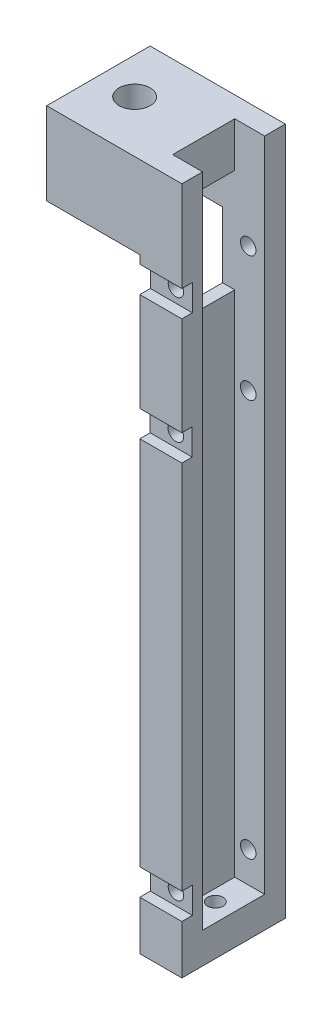
ISO-10303-21;
HEADER;
FILE_DESCRIPTION(('STEP AP214'),'2;1');
FILE_NAME('part.step','',(''),(''),'','','');
FILE_SCHEMA(('AUTOMOTIVE_DESIGN { 1 0 10303 214 1 1 1 1 }'));
ENDSEC;
DATA;
#1=APPLICATION_CONTEXT('core data for automotive mechanical design processes');
#2=APPLICATION_PROTOCOL_DEFINITION('international standard','automotive_design',2000,#1);
#3=PRODUCT_CONTEXT('',#1,'mechanical');
#4=PRODUCT('Part','Part','',(#3));
#5=PRODUCT_RELATED_PRODUCT_CATEGORY('part','',(#4));
#6=PRODUCT_DEFINITION_FORMATION('','',#4);
#7=PRODUCT_DEFINITION_CONTEXT('part definition',#1,'design');
#8=PRODUCT_DEFINITION('design','',#6,#7);
#9=PRODUCT_DEFINITION_SHAPE('','',#8);
#10=(LENGTH_UNIT() NAMED_UNIT(*) SI_UNIT(.MILLI.,.METRE.));
#11=(NAMED_UNIT(*) PLANE_ANGLE_UNIT() SI_UNIT($,.RADIAN.));
#12=(NAMED_UNIT(*) SI_UNIT($,.STERADIAN.) SOLID_ANGLE_UNIT());
#13=UNCERTAINTY_MEASURE_WITH_UNIT(LENGTH_MEASURE(1.E-05),#10,'distance_accuracy_value','');
#14=(GEOMETRIC_REPRESENTATION_CONTEXT(3) GLOBAL_UNCERTAINTY_ASSIGNED_CONTEXT((#13)) GLOBAL_UNIT_ASSIGNED_CONTEXT((#10,
#11,#12)) REPRESENTATION_CONTEXT('',''));
#15=CARTESIAN_POINT('',(0.,0.,0.));
#16=DIRECTION('',(0.,0.,1.));
#17=DIRECTION('',(1.,0.,0.));
#18=AXIS2_PLACEMENT_3D('',#15,#16,#17);
#19=CARTESIAN_POINT('',(-13.,53.147,10.));
#20=DIRECTION('',(0.,1.,0.));
#21=DIRECTION('',(0.,0.,1.));
#22=AXIS2_PLACEMENT_3D('',#19,#20,#21);
#23=PLANE('',#22);
#24=CARTESIAN_POINT('',(-9.5,53.147,5.));
#25=DIRECTION('',(0.,1.,0.));
#26=DIRECTION('',(0.,0.,1.));
#27=AXIS2_PLACEMENT_3D('',#24,#25,#26);
#28=CIRCLE('',#27,1.5);
#29=CARTESIAN_POINT('',(-9.5,53.147,6.5));
#30=VERTEX_POINT('',#29);
#31=EDGE_CURVE('E310',#30,#30,#28,.T.);
#32=ORIENTED_EDGE('',*,*,#31,.T.);
#33=EDGE_LOOP('',(#32));
#34=FACE_BOUND('',#33,.T.);
#35=DIRECTION('',(0.,0.,1.));
#36=VECTOR('',#35,1.);
#37=CARTESIAN_POINT('',(-13.,53.147,10.));
#38=LINE('',#37,#36);
#39=CARTESIAN_POINT('',(-13.,53.147,2.));
#40=VERTEX_POINT('',#39);
#41=CARTESIAN_POINT('',(-13.,53.147,8.));
#42=VERTEX_POINT('',#41);
#43=EDGE_CURVE('E276',#40,#42,#38,.T.);
#44=ORIENTED_EDGE('',*,*,#43,.F.);
#45=DIRECTION('',(1.,0.,0.));
#46=VECTOR('',#45,1.);
#47=CARTESIAN_POINT('',(-12.82,53.147,2.));
#48=LINE('',#47,#46);
#49=CARTESIAN_POINT('',(-2.82,53.147,2.));
#50=VERTEX_POINT('',#49);
#51=EDGE_CURVE('E55',#40,#50,#48,.T.);
#52=ORIENTED_EDGE('',*,*,#51,.T.);
#53=DIRECTION('',(0.,0.,1.));
#54=VECTOR('',#53,1.);
#55=CARTESIAN_POINT('',(-2.82,53.147,8.));
#56=LINE('',#55,#54);
#57=CARTESIAN_POINT('',(-2.82,53.147,8.));
#58=VERTEX_POINT('',#57);
#59=EDGE_CURVE('E453',#50,#58,#56,.T.);
#60=ORIENTED_EDGE('',*,*,#59,.T.);
#61=DIRECTION('',(1.,0.,0.));
#62=VECTOR('',#61,1.);
#63=CARTESIAN_POINT('',(-12.82,53.147,8.));
#64=LINE('',#63,#62);
#65=EDGE_CURVE('E464',#42,#58,#64,.T.);
#66=ORIENTED_EDGE('',*,*,#65,.F.);
#67=EDGE_LOOP('',(#44,#52,#60,#66));
#68=FACE_BOUND('',#67,.T.);
#69=ADVANCED_FACE('F38',(#34,#68),#23,.F.);
#70=CARTESIAN_POINT('',(-4.,17.5,10.));
#71=DIRECTION('',(1.,0.,0.));
#72=DIRECTION('',(0.,1.,0.));
#73=AXIS2_PLACEMENT_3D('',#70,#71,#72);
#74=PLANE('',#73);
#75=DIRECTION('',(0.,-1.,0.));
#76=VECTOR('',#75,1.);
#77=CARTESIAN_POINT('',(-4.,17.5,0.));
#78=LINE('',#77,#76);
#79=CARTESIAN_POINT('',(-4.00000000000001,49.497,0.));
#80=VERTEX_POINT('',#79);
#81=CARTESIAN_POINT('',(-4.,-9.02,0.));
#82=VERTEX_POINT('',#81);
#83=EDGE_CURVE('E42',#80,#82,#78,.T.);
#84=ORIENTED_EDGE('',*,*,#83,.T.);
#85=DIRECTION('',(0.,0.,-1.));
#86=VECTOR('',#85,1.);
#87=CARTESIAN_POINT('',(-4.,-9.02,0.));
#88=LINE('',#87,#86);
#89=CARTESIAN_POINT('',(-4.,-9.02,10.));
#90=VERTEX_POINT('',#89);
#91=EDGE_CURVE('E409',#90,#82,#88,.T.);
#92=ORIENTED_EDGE('',*,*,#91,.F.);
#93=DIRECTION('',(0.,-1.,0.));
#94=VECTOR('',#93,1.);
#95=CARTESIAN_POINT('',(-4.,17.5,10.));
#96=LINE('',#95,#94);
#97=CARTESIAN_POINT('',(-4.,-4.29,10.));
#98=VERTEX_POINT('',#97);
#99=EDGE_CURVE('E308',#98,#90,#96,.T.);
#100=ORIENTED_EDGE('',*,*,#99,.F.);
#101=DIRECTION('',(0.,0.,1.));
#102=VECTOR('',#101,1.);
#103=CARTESIAN_POINT('',(-4.,-4.29,8.984));
#104=LINE('',#103,#102);
#105=CARTESIAN_POINT('',(-4.,-4.29,8.984));
#106=VERTEX_POINT('',#105);
#107=EDGE_CURVE('E383',#106,#98,#104,.T.);
#108=ORIENTED_EDGE('',*,*,#107,.F.);
#109=DIRECTION('',(0.,-1.,0.));
#110=VECTOR('',#109,1.);
#111=CARTESIAN_POINT('',(-4.,-1.75,8.984));
#112=LINE('',#111,#110);
#113=CARTESIAN_POINT('',(-4.,-1.75,8.984));
#114=VERTEX_POINT('',#113);
#115=EDGE_CURVE('E370',#114,#106,#112,.T.);
#116=ORIENTED_EDGE('',*,*,#115,.F.);
#117=DIRECTION('',(0.,0.,1.));
#118=VECTOR('',#117,1.);
#119=CARTESIAN_POINT('',(-4.,-1.75,8.984));
#120=LINE('',#119,#118);
#121=CARTESIAN_POINT('',(-4.,-1.75,10.));
#122=VERTEX_POINT('',#121);
#123=EDGE_CURVE('E385',#114,#122,#120,.T.);
#124=ORIENTED_EDGE('',*,*,#123,.T.);
#125=CARTESIAN_POINT('',(-4.,34.0850485923421,10.));
#126=VERTEX_POINT('',#125);
#127=EDGE_CURVE('E309',#126,#122,#96,.T.);
#128=ORIENTED_EDGE('',*,*,#127,.F.);
#129=DIRECTION('',(0.,0.,1.));
#130=VECTOR('',#129,1.);
#131=CARTESIAN_POINT('',(-4.,34.0850485923421,9.));
#132=LINE('',#131,#130);
#133=CARTESIAN_POINT('',(-4.,34.0850485923421,9.));
#134=VERTEX_POINT('',#133);
#135=EDGE_CURVE('E359',#134,#126,#132,.T.);
#136=ORIENTED_EDGE('',*,*,#135,.F.);
#137=DIRECTION('',(0.,-1.,0.));
#138=VECTOR('',#137,1.);
#139=CARTESIAN_POINT('',(-4.,36.6250485923421,9.));
#140=LINE('',#139,#138);
#141=CARTESIAN_POINT('',(-4.,36.6250485923421,9.));
#142=VERTEX_POINT('',#141);
#143=EDGE_CURVE('E341',#142,#134,#140,.T.);
#144=ORIENTED_EDGE('',*,*,#143,.F.);
#145=DIRECTION('',(0.,0.,1.));
#146=VECTOR('',#145,1.);
#147=CARTESIAN_POINT('',(-4.,36.6250485923421,9.));
#148=LINE('',#147,#146);
#149=CARTESIAN_POINT('',(-4.,36.6250485923421,10.));
#150=VERTEX_POINT('',#149);
#151=EDGE_CURVE('E350',#142,#150,#148,.T.);
#152=ORIENTED_EDGE('',*,*,#151,.T.);
#153=CARTESIAN_POINT('',(-4.,46.1567314564562,10.));
#154=VERTEX_POINT('',#153);
#155=EDGE_CURVE('E48',#154,#150,#96,.T.);
#156=ORIENTED_EDGE('',*,*,#155,.F.);
#157=DIRECTION('',(0.,0.,1.));
#158=VECTOR('',#157,1.);
#159=CARTESIAN_POINT('',(-4.,46.1567314564562,8.984));
#160=LINE('',#159,#158);
#161=CARTESIAN_POINT('',(-4.,46.1567314564562,8.984));
#162=VERTEX_POINT('',#161);
#163=EDGE_CURVE('E402',#162,#154,#160,.T.);
#164=ORIENTED_EDGE('',*,*,#163,.F.);
#165=DIRECTION('',(0.,-1.,0.));
#166=VECTOR('',#165,1.);
#167=CARTESIAN_POINT('',(-4.,47.4267314564562,8.984));
#168=LINE('',#167,#166);
#169=CARTESIAN_POINT('',(-4.,48.6967314564562,8.984));
#170=VERTEX_POINT('',#169);
#171=EDGE_CURVE('E390',#170,#162,#168,.T.);
#172=ORIENTED_EDGE('',*,*,#171,.F.);
#173=DIRECTION('',(0.,0.,1.));
#174=VECTOR('',#173,1.);
#175=CARTESIAN_POINT('',(-4.,48.6967314564562,8.984));
#176=LINE('',#175,#174);
#177=CARTESIAN_POINT('',(-4.,48.6967314564562,10.));
#178=VERTEX_POINT('',#177);
#179=EDGE_CURVE('E406',#170,#178,#176,.T.);
#180=ORIENTED_EDGE('',*,*,#179,.T.);
#181=CARTESIAN_POINT('',(-4.,49.497,10.));
#182=VERTEX_POINT('',#181);
#183=EDGE_CURVE('E11',#182,#178,#96,.T.);
#184=ORIENTED_EDGE('',*,*,#183,.F.);
#185=DIRECTION('',(0.,0.,1.));
#186=VECTOR('',#185,1.);
#187=CARTESIAN_POINT('',(-4.,49.497,10.));
#188=LINE('',#187,#186);
#189=CARTESIAN_POINT('',(-4.,49.497,8.));
#190=VERTEX_POINT('',#189);
#191=EDGE_CURVE('E976',#190,#182,#188,.T.);
#192=ORIENTED_EDGE('',*,*,#191,.F.);
#193=DIRECTION('',(0.,-1.,0.));
#194=VECTOR('',#193,1.);
#195=CARTESIAN_POINT('',(-4.,17.5,7.99999999999999));
#196=LINE('',#195,#194);
#197=CARTESIAN_POINT('',(-4.00000000000001,43.147,8.));
#198=VERTEX_POINT('',#197);
#199=EDGE_CURVE('E470',#190,#198,#196,.T.);
#200=ORIENTED_EDGE('',*,*,#199,.T.);
#201=DIRECTION('',(0.,0.,-1.));
#202=VECTOR('',#201,1.);
#203=CARTESIAN_POINT('',(-4.00000000000001,43.147,10.));
#204=LINE('',#203,#202);
#205=CARTESIAN_POINT('',(-4.00000000000001,43.147,2.));
#206=VERTEX_POINT('',#205);
#207=EDGE_CURVE('E472',#198,#206,#204,.T.);
#208=ORIENTED_EDGE('',*,*,#207,.T.);
#209=DIRECTION('',(0.,1.,0.));
#210=VECTOR('',#209,1.);
#211=CARTESIAN_POINT('',(-4.,17.5,2.));
#212=LINE('',#211,#210);
#213=CARTESIAN_POINT('',(-4.,49.497,2.));
#214=VERTEX_POINT('',#213);
#215=EDGE_CURVE('E466',#206,#214,#212,.T.);
#216=ORIENTED_EDGE('',*,*,#215,.T.);
#217=DIRECTION('',(0.,0.,1.));
#218=VECTOR('',#217,1.);
#219=CARTESIAN_POINT('',(-4.,49.497,2.));
#220=LINE('',#219,#218);
#221=EDGE_CURVE('E438',#80,#214,#220,.T.);
#222=ORIENTED_EDGE('',*,*,#221,.F.);
#223=EDGE_LOOP('',(#84,#92,#100,#108,#116,#124,#128,#136,#144,#152,#156,#164,#172,#180,#184,
#192,#200,#208,#216,#222));
#224=FACE_BOUND('',#223,.T.);
#225=ADVANCED_FACE('F40',(#224),#74,.F.);
#226=CARTESIAN_POINT('',(-2.82,0.,8.));
#227=DIRECTION('',(1.,0.,0.));
#228=DIRECTION('',(0.,0.,-1.));
#229=AXIS2_PLACEMENT_3D('',#226,#227,#228);
#230=PLANE('',#229);
#231=ORIENTED_EDGE('',*,*,#59,.F.);
#232=DIRECTION('',(0.,1.,0.));
#233=VECTOR('',#232,1.);
#234=CARTESIAN_POINT('',(-2.82,0.,2.));
#235=LINE('',#234,#233);
#236=CARTESIAN_POINT('',(-2.82,57.465,2.));
#237=VERTEX_POINT('',#236);
#238=EDGE_CURVE('E297',#50,#237,#235,.T.);
#239=ORIENTED_EDGE('',*,*,#238,.T.);
#240=DIRECTION('',(0.,0.,-1.));
#241=VECTOR('',#240,1.);
#242=CARTESIAN_POINT('',(-2.82,57.465,2.));
#243=LINE('',#242,#241);
#244=CARTESIAN_POINT('',(-2.82,57.465,8.));
#245=VERTEX_POINT('',#244);
#246=EDGE_CURVE('E284',#245,#237,#243,.T.);
#247=ORIENTED_EDGE('',*,*,#246,.F.);
#248=DIRECTION('',(0.,-1.,0.));
#249=VECTOR('',#248,1.);
#250=CARTESIAN_POINT('',(-2.82,21.5,8.));
#251=LINE('',#250,#249);
#252=EDGE_CURVE('E294',#245,#58,#251,.T.);
#253=ORIENTED_EDGE('',*,*,#252,.T.);
#254=EDGE_LOOP('',(#231,#239,#247,#253));
#255=FACE_BOUND('',#254,.T.);
#256=ADVANCED_FACE('F451',(#255),#230,.T.);
#257=CARTESIAN_POINT('',(-0.819999999999999,21.5,10.));
#258=DIRECTION('',(0.,0.,1.));
#259=DIRECTION('',(1.,0.,0.));
#260=AXIS2_PLACEMENT_3D('',#257,#258,#259);
#261=PLANE('',#260);
#262=DIRECTION('',(-1.,0.,0.));
#263=VECTOR('',#262,1.);
#264=CARTESIAN_POINT('',(0.0690000000000009,36.6250485923421,10.));
#265=LINE('',#264,#263);
#266=CARTESIAN_POINT('',(0.0690000000000009,36.6250485923421,10.));
#267=VERTEX_POINT('',#266);
#268=EDGE_CURVE('E337',#267,#150,#265,.T.);
#269=ORIENTED_EDGE('',*,*,#268,.F.);
#270=DIRECTION('',(0.,-1.,0.));
#271=VECTOR('',#270,1.);
#272=CARTESIAN_POINT('',(0.0690000000000009,57.465,10.));
#273=LINE('',#272,#271);
#274=CARTESIAN_POINT('',(0.0690000000000009,46.1567314564562,10.));
#275=VERTEX_POINT('',#274);
#276=EDGE_CURVE('E265',#275,#267,#273,.T.);
#277=ORIENTED_EDGE('',*,*,#276,.F.);
#278=DIRECTION('',(1.,0.,0.));
#279=VECTOR('',#278,1.);
#280=CARTESIAN_POINT('',(0.0690000000000009,46.1567314564562,10.));
#281=LINE('',#280,#279);
#282=EDGE_CURVE('E382',#154,#275,#281,.T.);
#283=ORIENTED_EDGE('',*,*,#282,.F.);
#284=ORIENTED_EDGE('',*,*,#155,.T.);
#285=EDGE_LOOP('',(#269,#277,#283,#284));
#286=FACE_BOUND('',#285,.T.);
#287=ADVANCED_FACE('F539',(#286),#261,.T.);
#288=ORIENTED_EDGE('',*,*,#99,.T.);
#289=DIRECTION('',(-1.,0.,0.));
#290=VECTOR('',#289,1.);
#291=CARTESIAN_POINT('',(-4.,-9.02,10.));
#292=LINE('',#291,#290);
#293=CARTESIAN_POINT('',(0.0690000000000009,-9.02,10.));
#294=VERTEX_POINT('',#293);
#295=EDGE_CURVE('E251',#294,#90,#292,.T.);
#296=ORIENTED_EDGE('',*,*,#295,.F.);
#297=CARTESIAN_POINT('',(0.0690000000000009,-4.29,10.));
#298=VERTEX_POINT('',#297);
#299=EDGE_CURVE('E260',#298,#294,#273,.T.);
#300=ORIENTED_EDGE('',*,*,#299,.F.);
#301=DIRECTION('',(1.,0.,0.));
#302=VECTOR('',#301,1.);
#303=CARTESIAN_POINT('',(-4.,-4.29,10.));
#304=LINE('',#303,#302);
#305=EDGE_CURVE('E367',#98,#298,#304,.T.);
#306=ORIENTED_EDGE('',*,*,#305,.F.);
#307=EDGE_LOOP('',(#288,#296,#300,#306));
#308=FACE_BOUND('',#307,.T.);
#309=ADVANCED_FACE('F429',(#308),#261,.T.);
#310=DIRECTION('',(-1.,0.,0.));
#311=VECTOR('',#310,1.);
#312=CARTESIAN_POINT('',(-13.,49.497,10.));
#313=LINE('',#312,#311);
#314=CARTESIAN_POINT('',(-13.,49.497,10.));
#315=VERTEX_POINT('',#314);
#316=EDGE_CURVE('E978',#182,#315,#313,.T.);
#317=ORIENTED_EDGE('',*,*,#316,.F.);
#318=ORIENTED_EDGE('',*,*,#183,.T.);
#319=DIRECTION('',(-1.,0.,0.));
#320=VECTOR('',#319,1.);
#321=CARTESIAN_POINT('',(-4.,48.6967314564562,10.));
#322=LINE('',#321,#320);
#323=CARTESIAN_POINT('',(0.0690000000000007,48.6967314564562,10.));
#324=VERTEX_POINT('',#323);
#325=EDGE_CURVE('E394',#324,#178,#322,.T.);
#326=ORIENTED_EDGE('',*,*,#325,.F.);
#327=CARTESIAN_POINT('',(0.0690000000000009,57.465,10.));
#328=VERTEX_POINT('',#327);
#329=EDGE_CURVE('E261',#328,#324,#273,.T.);
#330=ORIENTED_EDGE('',*,*,#329,.F.);
#331=DIRECTION('',(1.,0.,0.));
#332=VECTOR('',#331,1.);
#333=CARTESIAN_POINT('',(-0.819999999999999,57.465,10.));
#334=LINE('',#333,#332);
#335=CARTESIAN_POINT('',(-13.,57.465,10.));
#336=VERTEX_POINT('',#335);
#337=EDGE_CURVE('E291',#336,#328,#334,.T.);
#338=ORIENTED_EDGE('',*,*,#337,.F.);
#339=DIRECTION('',(0.,1.,0.));
#340=VECTOR('',#339,1.);
#341=CARTESIAN_POINT('',(-13.,57.465,10.));
#342=LINE('',#341,#340);
#343=EDGE_CURVE('E278',#315,#336,#342,.T.);
#344=ORIENTED_EDGE('',*,*,#343,.F.);
#345=EDGE_LOOP('',(#317,#318,#326,#330,#338,#344));
#346=FACE_BOUND('',#345,.T.);
#347=ADVANCED_FACE('F537',(#346),#261,.T.);
#348=DIRECTION('',(1.,0.,0.));
#349=VECTOR('',#348,1.);
#350=CARTESIAN_POINT('',(-4.,34.0850485923421,10.));
#351=LINE('',#350,#349);
#352=CARTESIAN_POINT('',(0.0690000000000012,34.0850485923421,10.));
#353=VERTEX_POINT('',#352);
#354=EDGE_CURVE('E342',#126,#353,#351,.T.);
#355=ORIENTED_EDGE('',*,*,#354,.F.);
#356=ORIENTED_EDGE('',*,*,#127,.T.);
#357=DIRECTION('',(-1.,0.,0.));
#358=VECTOR('',#357,1.);
#359=CARTESIAN_POINT('',(0.0690000000000006,-1.75,10.));
#360=LINE('',#359,#358);
#361=CARTESIAN_POINT('',(0.0690000000000006,-1.75,10.));
#362=VERTEX_POINT('',#361);
#363=EDGE_CURVE('E355',#362,#122,#360,.T.);
#364=ORIENTED_EDGE('',*,*,#363,.F.);
#365=EDGE_CURVE('E266',#353,#362,#273,.T.);
#366=ORIENTED_EDGE('',*,*,#365,.F.);
#367=EDGE_LOOP('',(#355,#356,#364,#366));
#368=FACE_BOUND('',#367,.T.);
#369=ADVANCED_FACE('F535',(#368),#261,.T.);
#370=CARTESIAN_POINT('',(-0.819999999999999,21.5,0.));
#371=DIRECTION('',(0.,0.,1.));
#372=DIRECTION('',(1.,0.,0.));
#373=AXIS2_PLACEMENT_3D('',#370,#371,#372);
#374=PLANE('',#373);
#375=DIRECTION('',(-1.,0.,0.));
#376=VECTOR('',#375,1.);
#377=CARTESIAN_POINT('',(-4.,57.465,0.));
#378=LINE('',#377,#376);
#379=CARTESIAN_POINT('',(0.0690000000000009,57.465,0.));
#380=VERTEX_POINT('',#379);
#381=CARTESIAN_POINT('',(-13.,57.465,0.));
#382=VERTEX_POINT('',#381);
#383=EDGE_CURVE('E289',#380,#382,#378,.T.);
#384=ORIENTED_EDGE('',*,*,#383,.F.);
#385=DIRECTION('',(0.,1.,0.));
#386=VECTOR('',#385,1.);
#387=CARTESIAN_POINT('',(0.0690000000000009,0.,0.));
#388=LINE('',#387,#386);
#389=CARTESIAN_POINT('',(0.0690000000000009,-9.02,0.));
#390=VERTEX_POINT('',#389);
#391=EDGE_CURVE('E250',#390,#380,#388,.T.);
#392=ORIENTED_EDGE('',*,*,#391,.F.);
#393=DIRECTION('',(1.,0.,0.));
#394=VECTOR('',#393,1.);
#395=CARTESIAN_POINT('',(0.0690000000000009,-9.02,0.));
#396=LINE('',#395,#394);
#397=EDGE_CURVE('E418',#82,#390,#396,.T.);
#398=ORIENTED_EDGE('',*,*,#397,.F.);
#399=ORIENTED_EDGE('',*,*,#83,.F.);
#400=DIRECTION('',(1.,0.,0.));
#401=VECTOR('',#400,1.);
#402=CARTESIAN_POINT('',(-4.00000000000001,49.497,0.));
#403=LINE('',#402,#401);
#404=CARTESIAN_POINT('',(-13.,49.497,0.));
#405=VERTEX_POINT('',#404);
#406=EDGE_CURVE('E966',#405,#80,#403,.T.);
#407=ORIENTED_EDGE('',*,*,#406,.F.);
#408=DIRECTION('',(0.,-1.,0.));
#409=VECTOR('',#408,1.);
#410=CARTESIAN_POINT('',(-13.,53.147,0.));
#411=LINE('',#410,#409);
#412=EDGE_CURVE('E274',#382,#405,#411,.T.);
#413=ORIENTED_EDGE('',*,*,#412,.F.);
#414=EDGE_LOOP('',(#384,#392,#398,#399,#407,#413));
#415=FACE_BOUND('',#414,.T.);
#416=CARTESIAN_POINT('',(-1.51849999999999,-3.05,0.));
#417=DIRECTION('',(0.,0.,1.));
#418=DIRECTION('',(1.,0.,0.));
#419=AXIS2_PLACEMENT_3D('',#416,#417,#418);
#420=CIRCLE('',#419,0.75);
#421=CARTESIAN_POINT('',(-0.768499999999994,-3.05,0.));
#422=VERTEX_POINT('',#421);
#423=EDGE_CURVE('E484',#422,#422,#420,.T.);
#424=ORIENTED_EDGE('',*,*,#423,.T.);
#425=EDGE_LOOP('',(#424));
#426=FACE_BOUND('',#425,.T.);
#427=CARTESIAN_POINT('',(-1.5185,47.4567314564562,0.));
#428=DIRECTION('',(0.,0.,1.));
#429=DIRECTION('',(1.,0.,0.));
#430=AXIS2_PLACEMENT_3D('',#427,#428,#429);
#431=CIRCLE('',#430,0.75);
#432=CARTESIAN_POINT('',(-0.768499999999999,47.4567314564562,0.));
#433=VERTEX_POINT('',#432);
#434=EDGE_CURVE('E320',#433,#433,#431,.T.);
#435=ORIENTED_EDGE('',*,*,#434,.T.);
#436=EDGE_LOOP('',(#435));
#437=FACE_BOUND('',#436,.T.);
#438=CARTESIAN_POINT('',(-1.5185,35.3550485923421,0.));
#439=DIRECTION('',(0.,0.,1.));
#440=DIRECTION('',(1.,0.,0.));
#441=AXIS2_PLACEMENT_3D('',#438,#439,#440);
#442=CIRCLE('',#441,0.755649999999995);
#443=CARTESIAN_POINT('',(-0.762850000000004,35.3550485923421,0.));
#444=VERTEX_POINT('',#443);
#445=EDGE_CURVE('E334',#444,#444,#442,.T.);
#446=ORIENTED_EDGE('',*,*,#445,.T.);
#447=EDGE_LOOP('',(#446));
#448=FACE_BOUND('',#447,.T.);
#449=ADVANCED_FACE('F442',(#415,#426,#437,#448),#374,.F.);
#450=CARTESIAN_POINT('',(-2.82,21.5,8.));
#451=DIRECTION('',(0.,0.,1.));
#452=DIRECTION('',(1.,0.,0.));
#453=AXIS2_PLACEMENT_3D('',#450,#451,#452);
#454=PLANE('',#453);
#455=CARTESIAN_POINT('',(-1.51849999999999,-3.05,8.));
#456=DIRECTION('',(0.,0.,1.));
#457=DIRECTION('',(1.,0.,0.));
#458=AXIS2_PLACEMENT_3D('',#455,#456,#457);
#459=CIRCLE('',#458,0.75);
#460=CARTESIAN_POINT('',(-0.768499999999994,-3.05,8.));
#461=VERTEX_POINT('',#460);
#462=EDGE_CURVE('E481',#461,#461,#459,.T.);
#463=ORIENTED_EDGE('',*,*,#462,.T.);
#464=EDGE_LOOP('',(#463));
#465=FACE_BOUND('',#464,.T.);
#466=CARTESIAN_POINT('',(-1.5185,47.4567314564562,8.));
#467=DIRECTION('',(0.,0.,1.));
#468=DIRECTION('',(1.,0.,0.));
#469=AXIS2_PLACEMENT_3D('',#466,#467,#468);
#470=CIRCLE('',#469,0.75);
#471=CARTESIAN_POINT('',(-0.768499999999999,47.4567314564562,8.));
#472=VERTEX_POINT('',#471);
#473=EDGE_CURVE('E325',#472,#472,#470,.T.);
#474=ORIENTED_EDGE('',*,*,#473,.T.);
#475=EDGE_LOOP('',(#474));
#476=FACE_BOUND('',#475,.T.);
#477=CARTESIAN_POINT('',(-1.5185,35.3550485923421,8.));
#478=DIRECTION('',(0.,0.,1.));
#479=DIRECTION('',(1.,0.,0.));
#480=AXIS2_PLACEMENT_3D('',#477,#478,#479);
#481=CIRCLE('',#480,0.755649999999995);
#482=CARTESIAN_POINT('',(-0.762850000000004,35.3550485923421,8.));
#483=VERTEX_POINT('',#482);
#484=EDGE_CURVE('E331',#483,#483,#481,.T.);
#485=ORIENTED_EDGE('',*,*,#484,.T.);
#486=EDGE_LOOP('',(#485));
#487=FACE_BOUND('',#486,.T.);
#488=DIRECTION('',(0.,1.,0.));
#489=VECTOR('',#488,1.);
#490=CARTESIAN_POINT('',(0.0690000000000009,0.,8.));
#491=LINE('',#490,#489);
#492=CARTESIAN_POINT('',(0.0690000000000009,-6.02,8.));
#493=VERTEX_POINT('',#492);
#494=CARTESIAN_POINT('',(0.0690000000000009,57.465,8.));
#495=VERTEX_POINT('',#494);
#496=EDGE_CURVE('E264',#493,#495,#491,.T.);
#497=ORIENTED_EDGE('',*,*,#496,.F.);
#498=DIRECTION('',(-1.,0.,0.));
#499=VECTOR('',#498,1.);
#500=CARTESIAN_POINT('',(-2.82,-6.02,8.));
#501=LINE('',#500,#499);
#502=CARTESIAN_POINT('',(-2.82,-6.02,8.));
#503=VERTEX_POINT('',#502);
#504=EDGE_CURVE('E232',#493,#503,#501,.T.);
#505=ORIENTED_EDGE('',*,*,#504,.T.);
#506=CARTESIAN_POINT('',(-2.82,43.147,8.));
#507=VERTEX_POINT('',#506);
#508=EDGE_CURVE('E293',#507,#503,#251,.T.);
#509=ORIENTED_EDGE('',*,*,#508,.F.);
#510=DIRECTION('',(1.,0.,0.));
#511=VECTOR('',#510,1.);
#512=CARTESIAN_POINT('',(-12.82,43.147,8.));
#513=LINE('',#512,#511);
#514=EDGE_CURVE('E456',#198,#507,#513,.T.);
#515=ORIENTED_EDGE('',*,*,#514,.F.);
#516=ORIENTED_EDGE('',*,*,#199,.F.);
#517=DIRECTION('',(1.,0.,0.));
#518=VECTOR('',#517,1.);
#519=CARTESIAN_POINT('',(-4.,49.497,8.));
#520=LINE('',#519,#518);
#521=CARTESIAN_POINT('',(-13.,49.497,8.));
#522=VERTEX_POINT('',#521);
#523=EDGE_CURVE('E974',#522,#190,#520,.T.);
#524=ORIENTED_EDGE('',*,*,#523,.F.);
#525=DIRECTION('',(0.,1.,0.));
#526=VECTOR('',#525,1.);
#527=CARTESIAN_POINT('',(-13.,49.497,8.));
#528=LINE('',#527,#526);
#529=EDGE_CURVE('E460',#522,#42,#528,.T.);
#530=ORIENTED_EDGE('',*,*,#529,.T.);
#531=ORIENTED_EDGE('',*,*,#65,.T.);
#532=ORIENTED_EDGE('',*,*,#252,.F.);
#533=DIRECTION('',(-1.,0.,0.));
#534=VECTOR('',#533,1.);
#535=CARTESIAN_POINT('',(-2.82,57.465,8.));
#536=LINE('',#535,#534);
#537=EDGE_CURVE('E281',#495,#245,#536,.T.);
#538=ORIENTED_EDGE('',*,*,#537,.F.);
#539=EDGE_LOOP('',(#497,#505,#509,#515,#516,#524,#530,#531,#532,#538));
#540=FACE_BOUND('',#539,.T.);
#541=ADVANCED_FACE('F495',(#465,#476,#487,#540),#454,.F.);
#542=CARTESIAN_POINT('',(-2.82,0.,2.));
#543=DIRECTION('',(0.,0.,-1.));
#544=DIRECTION('',(-1.,0.,0.));
#545=AXIS2_PLACEMENT_3D('',#542,#543,#544);
#546=PLANE('',#545);
#547=CARTESIAN_POINT('',(-1.51849999999999,-3.05,2.));
#548=DIRECTION('',(0.,0.,-1.));
#549=DIRECTION('',(-1.,0.,0.));
#550=AXIS2_PLACEMENT_3D('',#547,#548,#549);
#551=CIRCLE('',#550,0.75);
#552=CARTESIAN_POINT('',(-2.26849999999999,-3.05,2.));
#553=VERTEX_POINT('',#552);
#554=EDGE_CURVE('E478',#553,#553,#551,.T.);
#555=ORIENTED_EDGE('',*,*,#554,.T.);
#556=EDGE_LOOP('',(#555));
#557=FACE_BOUND('',#556,.T.);
#558=CARTESIAN_POINT('',(-1.5185,47.4567314564562,2.));
#559=DIRECTION('',(0.,0.,-1.));
#560=DIRECTION('',(-1.,0.,0.));
#561=AXIS2_PLACEMENT_3D('',#558,#559,#560);
#562=CIRCLE('',#561,0.75);
#563=CARTESIAN_POINT('',(-2.2685,47.4567314564562,2.));
#564=VERTEX_POINT('',#563);
#565=EDGE_CURVE('E490',#564,#564,#562,.T.);
#566=ORIENTED_EDGE('',*,*,#565,.T.);
#567=EDGE_LOOP('',(#566));
#568=FACE_BOUND('',#567,.T.);
#569=CARTESIAN_POINT('',(-1.5185,35.3550485923421,2.));
#570=DIRECTION('',(0.,0.,-1.));
#571=DIRECTION('',(-1.,0.,0.));
#572=AXIS2_PLACEMENT_3D('',#569,#570,#571);
#573=CIRCLE('',#572,0.755649999999995);
#574=CARTESIAN_POINT('',(-2.27414999999999,35.3550485923421,2.));
#575=VERTEX_POINT('',#574);
#576=EDGE_CURVE('E317',#575,#575,#573,.T.);
#577=ORIENTED_EDGE('',*,*,#576,.T.);
#578=EDGE_LOOP('',(#577));
#579=FACE_BOUND('',#578,.T.);
#580=CARTESIAN_POINT('',(-2.82,-6.02,2.));
#581=VERTEX_POINT('',#580);
#582=CARTESIAN_POINT('',(-2.82,43.147,2.));
#583=VERTEX_POINT('',#582);
#584=EDGE_CURVE('E244',#581,#583,#235,.T.);
#585=ORIENTED_EDGE('',*,*,#584,.F.);
#586=DIRECTION('',(1.,0.,0.));
#587=VECTOR('',#586,1.);
#588=CARTESIAN_POINT('',(-2.82,-6.02,2.));
#589=LINE('',#588,#587);
#590=CARTESIAN_POINT('',(0.0690000000000009,-6.02,2.));
#591=VERTEX_POINT('',#590);
#592=EDGE_CURVE('E229',#581,#591,#589,.T.);
#593=ORIENTED_EDGE('',*,*,#592,.T.);
#594=DIRECTION('',(0.,-1.,0.));
#595=VECTOR('',#594,1.);
#596=CARTESIAN_POINT('',(0.0690000000000009,57.465,2.));
#597=LINE('',#596,#595);
#598=CARTESIAN_POINT('',(0.0690000000000009,57.465,2.));
#599=VERTEX_POINT('',#598);
#600=EDGE_CURVE('E243',#599,#591,#597,.T.);
#601=ORIENTED_EDGE('',*,*,#600,.F.);
#602=DIRECTION('',(1.,0.,0.));
#603=VECTOR('',#602,1.);
#604=CARTESIAN_POINT('',(-0.819999999999999,57.465,2.));
#605=LINE('',#604,#603);
#606=EDGE_CURVE('E287',#237,#599,#605,.T.);
#607=ORIENTED_EDGE('',*,*,#606,.F.);
#608=ORIENTED_EDGE('',*,*,#238,.F.);
#609=ORIENTED_EDGE('',*,*,#51,.F.);
#610=DIRECTION('',(0.,1.,0.));
#611=VECTOR('',#610,1.);
#612=CARTESIAN_POINT('',(-13.,49.497,2.));
#613=LINE('',#612,#611);
#614=CARTESIAN_POINT('',(-13.,49.497,2.));
#615=VERTEX_POINT('',#614);
#616=EDGE_CURVE('E969',#615,#40,#613,.T.);
#617=ORIENTED_EDGE('',*,*,#616,.F.);
#618=DIRECTION('',(-1.,0.,0.));
#619=VECTOR('',#618,1.);
#620=CARTESIAN_POINT('',(-4.,49.497,2.));
#621=LINE('',#620,#619);
#622=EDGE_CURVE('E960',#214,#615,#621,.T.);
#623=ORIENTED_EDGE('',*,*,#622,.F.);
#624=ORIENTED_EDGE('',*,*,#215,.F.);
#625=DIRECTION('',(1.,0.,0.));
#626=VECTOR('',#625,1.);
#627=CARTESIAN_POINT('',(-12.82,43.147,2.));
#628=LINE('',#627,#626);
#629=EDGE_CURVE('E63',#206,#583,#628,.T.);
#630=ORIENTED_EDGE('',*,*,#629,.T.);
#631=EDGE_LOOP('',(#585,#593,#601,#607,#608,#609,#617,#623,#624,#630));
#632=FACE_BOUND('',#631,.T.);
#633=ADVANCED_FACE('F241',(#557,#568,#579,#632),#546,.F.);
#634=DIRECTION('',(0.,0.,1.));
#635=VECTOR('',#634,1.);
#636=CARTESIAN_POINT('',(-2.82,-6.02,8.));
#637=LINE('',#636,#635);
#638=EDGE_CURVE('E236',#581,#503,#637,.T.);
#639=ORIENTED_EDGE('',*,*,#638,.F.);
#640=ORIENTED_EDGE('',*,*,#584,.T.);
#641=DIRECTION('',(0.,0.,-1.));
#642=VECTOR('',#641,1.);
#643=CARTESIAN_POINT('',(-2.82,43.147,8.));
#644=LINE('',#643,#642);
#645=EDGE_CURVE('E457',#507,#583,#644,.T.);
#646=ORIENTED_EDGE('',*,*,#645,.F.);
#647=ORIENTED_EDGE('',*,*,#508,.T.);
#648=EDGE_LOOP('',(#639,#640,#646,#647));
#649=FACE_BOUND('',#648,.T.);
#650=ADVANCED_FACE('F524',(#649),#230,.T.);
#651=CARTESIAN_POINT('',(-0.819999999999999,57.465,10.));
#652=DIRECTION('',(0.,-1.,0.));
#653=DIRECTION('',(0.,0.,-1.));
#654=AXIS2_PLACEMENT_3D('',#651,#652,#653);
#655=PLANE('',#654);
#656=CARTESIAN_POINT('',(-9.5,57.465,5.));
#657=DIRECTION('',(0.,1.,0.));
#658=DIRECTION('',(0.,0.,1.));
#659=AXIS2_PLACEMENT_3D('',#656,#657,#658);
#660=CIRCLE('',#659,1.5);
#661=CARTESIAN_POINT('',(-9.5,57.465,6.5));
#662=VERTEX_POINT('',#661);
#663=EDGE_CURVE('E313',#662,#662,#660,.T.);
#664=ORIENTED_EDGE('',*,*,#663,.F.);
#665=EDGE_LOOP('',(#664));
#666=FACE_BOUND('',#665,.T.);
#667=ORIENTED_EDGE('',*,*,#337,.T.);
#668=DIRECTION('',(0.,0.,1.));
#669=VECTOR('',#668,1.);
#670=CARTESIAN_POINT('',(0.0690000000000009,57.465,8.));
#671=LINE('',#670,#669);
#672=EDGE_CURVE('E268',#495,#328,#671,.T.);
#673=ORIENTED_EDGE('',*,*,#672,.F.);
#674=ORIENTED_EDGE('',*,*,#537,.T.);
#675=ORIENTED_EDGE('',*,*,#246,.T.);
#676=ORIENTED_EDGE('',*,*,#606,.T.);
#677=DIRECTION('',(0.,0.,1.));
#678=VECTOR('',#677,1.);
#679=CARTESIAN_POINT('',(0.0690000000000009,57.465,0.));
#680=LINE('',#679,#678);
#681=EDGE_CURVE('E249',#380,#599,#680,.T.);
#682=ORIENTED_EDGE('',*,*,#681,.F.);
#683=ORIENTED_EDGE('',*,*,#383,.T.);
#684=DIRECTION('',(0.,0.,-1.));
#685=VECTOR('',#684,1.);
#686=CARTESIAN_POINT('',(-13.,57.465,0.));
#687=LINE('',#686,#685);
#688=EDGE_CURVE('E271',#336,#382,#687,.T.);
#689=ORIENTED_EDGE('',*,*,#688,.F.);
#690=EDGE_LOOP('',(#667,#673,#674,#675,#676,#682,#683,#689));
#691=FACE_BOUND('',#690,.T.);
#692=ADVANCED_FACE('F447',(#666,#691),#655,.F.);
#693=CARTESIAN_POINT('',(-13.,57.465,10.));
#694=DIRECTION('',(1.,0.,0.));
#695=DIRECTION('',(0.,0.,-1.));
#696=AXIS2_PLACEMENT_3D('',#693,#694,#695);
#697=PLANE('',#696);
#698=ORIENTED_EDGE('',*,*,#688,.T.);
#699=ORIENTED_EDGE('',*,*,#412,.T.);
#700=DIRECTION('',(0.,0.,-1.));
#701=VECTOR('',#700,1.);
#702=CARTESIAN_POINT('',(-13.,49.497,2.));
#703=LINE('',#702,#701);
#704=EDGE_CURVE('E963',#615,#405,#703,.T.);
#705=ORIENTED_EDGE('',*,*,#704,.F.);
#706=ORIENTED_EDGE('',*,*,#616,.T.);
#707=ORIENTED_EDGE('',*,*,#43,.T.);
#708=ORIENTED_EDGE('',*,*,#529,.F.);
#709=DIRECTION('',(0.,0.,-1.));
#710=VECTOR('',#709,1.);
#711=CARTESIAN_POINT('',(-13.,49.497,8.));
#712=LINE('',#711,#710);
#713=EDGE_CURVE('E971',#315,#522,#712,.T.);
#714=ORIENTED_EDGE('',*,*,#713,.F.);
#715=ORIENTED_EDGE('',*,*,#343,.T.);
#716=EDGE_LOOP('',(#698,#699,#705,#706,#707,#708,#714,#715));
#717=FACE_BOUND('',#716,.T.);
#718=ADVANCED_FACE('F520',(#717),#697,.F.);
#719=CARTESIAN_POINT('',(0.0690000000000009,0.,10.));
#720=DIRECTION('',(1.,0.,0.));
#721=DIRECTION('',(0.,0.,-1.));
#722=AXIS2_PLACEMENT_3D('',#719,#720,#721);
#723=PLANE('',#722);
#724=ORIENTED_EDGE('',*,*,#299,.T.);
#725=DIRECTION('',(0.,0.,1.));
#726=VECTOR('',#725,1.);
#727=CARTESIAN_POINT('',(0.0690000000000009,-9.02,2.));
#728=LINE('',#727,#726);
#729=EDGE_CURVE('E255',#390,#294,#728,.T.);
#730=ORIENTED_EDGE('',*,*,#729,.F.);
#731=ORIENTED_EDGE('',*,*,#391,.T.);
#732=ORIENTED_EDGE('',*,*,#681,.T.);
#733=ORIENTED_EDGE('',*,*,#600,.T.);
#734=DIRECTION('',(0.,0.,1.));
#735=VECTOR('',#734,1.);
#736=CARTESIAN_POINT('',(0.0690000000000009,-6.02,10.));
#737=LINE('',#736,#735);
#738=EDGE_CURVE('E226',#591,#493,#737,.T.);
#739=ORIENTED_EDGE('',*,*,#738,.T.);
#740=ORIENTED_EDGE('',*,*,#496,.T.);
#741=ORIENTED_EDGE('',*,*,#672,.T.);
#742=ORIENTED_EDGE('',*,*,#329,.T.);
#743=DIRECTION('',(0.,0.,1.));
#744=VECTOR('',#743,1.);
#745=CARTESIAN_POINT('',(0.0690000000000007,48.6967314564562,8.984));
#746=LINE('',#745,#744);
#747=CARTESIAN_POINT('',(0.0690000000000007,48.6967314564562,8.984));
#748=VERTEX_POINT('',#747);
#749=EDGE_CURVE('E410',#748,#324,#746,.T.);
#750=ORIENTED_EDGE('',*,*,#749,.F.);
#751=DIRECTION('',(0.,1.,0.));
#752=VECTOR('',#751,1.);
#753=CARTESIAN_POINT('',(0.0690000000000007,48.6967314564562,8.984));
#754=LINE('',#753,#752);
#755=CARTESIAN_POINT('',(0.0690000000000009,46.1567314564562,8.984));
#756=VERTEX_POINT('',#755);
#757=EDGE_CURVE('E396',#756,#748,#754,.T.);
#758=ORIENTED_EDGE('',*,*,#757,.F.);
#759=DIRECTION('',(0.,0.,1.));
#760=VECTOR('',#759,1.);
#761=CARTESIAN_POINT('',(0.0690000000000009,46.1567314564562,8.984));
#762=LINE('',#761,#760);
#763=EDGE_CURVE('E412',#756,#275,#762,.T.);
#764=ORIENTED_EDGE('',*,*,#763,.T.);
#765=ORIENTED_EDGE('',*,*,#276,.T.);
#766=DIRECTION('',(0.,0.,1.));
#767=VECTOR('',#766,1.);
#768=CARTESIAN_POINT('',(0.0690000000000009,36.6250485923421,9.));
#769=LINE('',#768,#767);
#770=CARTESIAN_POINT('',(0.0690000000000009,36.6250485923421,9.));
#771=VERTEX_POINT('',#770);
#772=EDGE_CURVE('E353',#771,#267,#769,.T.);
#773=ORIENTED_EDGE('',*,*,#772,.F.);
#774=DIRECTION('',(0.,1.,0.));
#775=VECTOR('',#774,1.);
#776=CARTESIAN_POINT('',(0.0690000000000012,34.0850485923421,9.));
#777=LINE('',#776,#775);
#778=CARTESIAN_POINT('',(0.0690000000000009,34.0850485923421,9.));
#779=VERTEX_POINT('',#778);
#780=EDGE_CURVE('E347',#779,#771,#777,.T.);
#781=ORIENTED_EDGE('',*,*,#780,.F.);
#782=DIRECTION('',(0.,0.,1.));
#783=VECTOR('',#782,1.);
#784=CARTESIAN_POINT('',(0.0690000000000012,34.0850485923421,9.));
#785=LINE('',#784,#783);
#786=EDGE_CURVE('E356',#779,#353,#785,.T.);
#787=ORIENTED_EDGE('',*,*,#786,.T.);
#788=ORIENTED_EDGE('',*,*,#365,.T.);
#789=DIRECTION('',(0.,0.,1.));
#790=VECTOR('',#789,1.);
#791=CARTESIAN_POINT('',(0.0690000000000006,-1.75,8.984));
#792=LINE('',#791,#790);
#793=CARTESIAN_POINT('',(0.0690000000000006,-1.75,8.984));
#794=VERTEX_POINT('',#793);
#795=EDGE_CURVE('E375',#794,#362,#792,.T.);
#796=ORIENTED_EDGE('',*,*,#795,.F.);
#797=DIRECTION('',(0.,1.,0.));
#798=VECTOR('',#797,1.);
#799=CARTESIAN_POINT('',(0.0690000000000007,-3.02,8.984));
#800=LINE('',#799,#798);
#801=CARTESIAN_POINT('',(0.0690000000000009,-4.29,8.984));
#802=VERTEX_POINT('',#801);
#803=EDGE_CURVE('E363',#802,#794,#800,.T.);
#804=ORIENTED_EDGE('',*,*,#803,.F.);
#805=DIRECTION('',(0.,0.,1.));
#806=VECTOR('',#805,1.);
#807=CARTESIAN_POINT('',(0.0690000000000009,-4.29,8.984));
#808=LINE('',#807,#806);
#809=EDGE_CURVE('E379',#802,#298,#808,.T.);
#810=ORIENTED_EDGE('',*,*,#809,.T.);
#811=EDGE_LOOP('',(#724,#730,#731,#732,#733,#739,#740,#741,#742,#750,#758,#764,#765,#773,#781,
#787,#788,#796,#804,#810));
#812=FACE_BOUND('',#811,.T.);
#813=ADVANCED_FACE('F247',(#812),#723,.T.);
#814=CARTESIAN_POINT('',(-4.,-9.02,10.));
#815=DIRECTION('',(0.,1.,0.));
#816=DIRECTION('',(0.,0.,1.));
#817=AXIS2_PLACEMENT_3D('',#814,#815,#816);
#818=PLANE('',#817);
#819=CARTESIAN_POINT('',(-1.7,-9.02,5.));
#820=DIRECTION('',(0.,-1.,0.));
#821=DIRECTION('',(0.,0.,-1.));
#822=AXIS2_PLACEMENT_3D('',#819,#820,#821);
#823=CIRCLE('',#822,0.75);
#824=CARTESIAN_POINT('',(-1.7,-9.02,4.25));
#825=VERTEX_POINT('',#824);
#826=EDGE_CURVE('E954',#825,#825,#823,.T.);
#827=ORIENTED_EDGE('',*,*,#826,.F.);
#828=EDGE_LOOP('',(#827));
#829=FACE_BOUND('',#828,.T.);
#830=ORIENTED_EDGE('',*,*,#729,.T.);
#831=ORIENTED_EDGE('',*,*,#295,.T.);
#832=ORIENTED_EDGE('',*,*,#91,.T.);
#833=ORIENTED_EDGE('',*,*,#397,.T.);
#834=EDGE_LOOP('',(#830,#831,#832,#833));
#835=FACE_BOUND('',#834,.T.);
#836=ADVANCED_FACE('F424',(#829,#835),#818,.F.);
#837=CARTESIAN_POINT('',(-4.,48.6967314564562,8.984));
#838=DIRECTION('',(0.,1.,0.));
#839=DIRECTION('',(0.,0.,1.));
#840=AXIS2_PLACEMENT_3D('',#837,#838,#839);
#841=PLANE('',#840);
#842=ORIENTED_EDGE('',*,*,#325,.T.);
#843=ORIENTED_EDGE('',*,*,#179,.F.);
#844=DIRECTION('',(-1.,0.,0.));
#845=VECTOR('',#844,1.);
#846=CARTESIAN_POINT('',(-4.,48.6967314564562,8.984));
#847=LINE('',#846,#845);
#848=EDGE_CURVE('E399',#748,#170,#847,.T.);
#849=ORIENTED_EDGE('',*,*,#848,.F.);
#850=ORIENTED_EDGE('',*,*,#749,.T.);
#851=EDGE_LOOP('',(#842,#843,#849,#850));
#852=FACE_BOUND('',#851,.T.);
#853=ADVANCED_FACE('F585',(#852),#841,.F.);
#854=CARTESIAN_POINT('',(0.0690000000000009,46.1567314564562,8.984));
#855=DIRECTION('',(0.,-1.,0.));
#856=DIRECTION('',(0.,0.,-1.));
#857=AXIS2_PLACEMENT_3D('',#854,#855,#856);
#858=PLANE('',#857);
#859=ORIENTED_EDGE('',*,*,#282,.T.);
#860=ORIENTED_EDGE('',*,*,#763,.F.);
#861=DIRECTION('',(1.,0.,0.));
#862=VECTOR('',#861,1.);
#863=CARTESIAN_POINT('',(0.0690000000000009,46.1567314564562,8.984));
#864=LINE('',#863,#862);
#865=EDGE_CURVE('E393',#162,#756,#864,.T.);
#866=ORIENTED_EDGE('',*,*,#865,.F.);
#867=ORIENTED_EDGE('',*,*,#163,.T.);
#868=EDGE_LOOP('',(#859,#860,#866,#867));
#869=FACE_BOUND('',#868,.T.);
#870=ADVANCED_FACE('F594',(#869),#858,.F.);
#871=CARTESIAN_POINT('',(-4.,46.1567314564562,8.984));
#872=DIRECTION('',(0.,0.,-1.));
#873=DIRECTION('',(-1.,0.,0.));
#874=AXIS2_PLACEMENT_3D('',#871,#872,#873);
#875=PLANE('',#874);
#876=CARTESIAN_POINT('',(-1.5185,47.4567314564562,8.984));
#877=DIRECTION('',(0.,0.,1.));
#878=DIRECTION('',(1.,0.,0.));
#879=AXIS2_PLACEMENT_3D('',#876,#877,#878);
#880=CIRCLE('',#879,0.75);
#881=CARTESIAN_POINT('',(-0.768499999999999,47.4567314564562,8.984));
#882=VERTEX_POINT('',#881);
#883=EDGE_CURVE('E487',#882,#882,#880,.T.);
#884=ORIENTED_EDGE('',*,*,#883,.F.);
#885=EDGE_LOOP('',(#884));
#886=FACE_BOUND('',#885,.T.);
#887=ORIENTED_EDGE('',*,*,#171,.T.);
#888=ORIENTED_EDGE('',*,*,#865,.T.);
#889=ORIENTED_EDGE('',*,*,#757,.T.);
#890=ORIENTED_EDGE('',*,*,#848,.T.);
#891=EDGE_LOOP('',(#887,#888,#889,#890));
#892=FACE_BOUND('',#891,.T.);
#893=ADVANCED_FACE('F602',(#886,#892),#875,.F.);
#894=CARTESIAN_POINT('',(-4.,-4.29,8.984));
#895=DIRECTION('',(0.,-1.,0.));
#896=DIRECTION('',(0.,0.,-1.));
#897=AXIS2_PLACEMENT_3D('',#894,#895,#896);
#898=PLANE('',#897);
#899=ORIENTED_EDGE('',*,*,#305,.T.);
#900=ORIENTED_EDGE('',*,*,#809,.F.);
#901=DIRECTION('',(1.,0.,0.));
#902=VECTOR('',#901,1.);
#903=CARTESIAN_POINT('',(-4.,-4.29,8.984));
#904=LINE('',#903,#902);
#905=EDGE_CURVE('E373',#106,#802,#904,.T.);
#906=ORIENTED_EDGE('',*,*,#905,.F.);
#907=ORIENTED_EDGE('',*,*,#107,.T.);
#908=EDGE_LOOP('',(#899,#900,#906,#907));
#909=FACE_BOUND('',#908,.T.);
#910=ADVANCED_FACE('F611',(#909),#898,.F.);
#911=CARTESIAN_POINT('',(0.0690000000000006,-1.75,8.984));
#912=DIRECTION('',(0.,1.,0.));
#913=DIRECTION('',(-1.,0.,0.));
#914=AXIS2_PLACEMENT_3D('',#911,#912,#913);
#915=PLANE('',#914);
#916=ORIENTED_EDGE('',*,*,#363,.T.);
#917=ORIENTED_EDGE('',*,*,#123,.F.);
#918=DIRECTION('',(-1.,0.,0.));
#919=VECTOR('',#918,1.);
#920=CARTESIAN_POINT('',(0.0690000000000006,-1.75,8.984));
#921=LINE('',#920,#919);
#922=EDGE_CURVE('E366',#794,#114,#921,.T.);
#923=ORIENTED_EDGE('',*,*,#922,.F.);
#924=ORIENTED_EDGE('',*,*,#795,.T.);
#925=EDGE_LOOP('',(#916,#917,#923,#924));
#926=FACE_BOUND('',#925,.T.);
#927=ADVANCED_FACE('F619',(#926),#915,.F.);
#928=CARTESIAN_POINT('',(0.0690000000000006,-1.75,8.984));
#929=DIRECTION('',(0.,0.,1.));
#930=DIRECTION('',(1.,0.,0.));
#931=AXIS2_PLACEMENT_3D('',#928,#929,#930);
#932=PLANE('',#931);
#933=CARTESIAN_POINT('',(-1.51849999999999,-3.05,8.984));
#934=DIRECTION('',(0.,0.,1.));
#935=DIRECTION('',(1.,0.,0.));
#936=AXIS2_PLACEMENT_3D('',#933,#934,#935);
#937=CIRCLE('',#936,0.75);
#938=CARTESIAN_POINT('',(-0.768499999999994,-3.05,8.984));
#939=VERTEX_POINT('',#938);
#940=EDGE_CURVE('E475',#939,#939,#937,.T.);
#941=ORIENTED_EDGE('',*,*,#940,.F.);
#942=EDGE_LOOP('',(#941));
#943=FACE_BOUND('',#942,.T.);
#944=ORIENTED_EDGE('',*,*,#803,.T.);
#945=ORIENTED_EDGE('',*,*,#922,.T.);
#946=ORIENTED_EDGE('',*,*,#115,.T.);
#947=ORIENTED_EDGE('',*,*,#905,.T.);
#948=EDGE_LOOP('',(#944,#945,#946,#947));
#949=FACE_BOUND('',#948,.T.);
#950=ADVANCED_FACE('F627',(#943,#949),#932,.T.);
#951=CARTESIAN_POINT('',(0.0690000000000009,36.6250485923421,9.));
#952=DIRECTION('',(0.,1.,0.));
#953=DIRECTION('',(0.,0.,1.));
#954=AXIS2_PLACEMENT_3D('',#951,#952,#953);
#955=PLANE('',#954);
#956=ORIENTED_EDGE('',*,*,#268,.T.);
#957=ORIENTED_EDGE('',*,*,#151,.F.);
#958=DIRECTION('',(-1.,0.,0.));
#959=VECTOR('',#958,1.);
#960=CARTESIAN_POINT('',(0.0690000000000009,36.6250485923421,9.));
#961=LINE('',#960,#959);
#962=EDGE_CURVE('E338',#771,#142,#961,.T.);
#963=ORIENTED_EDGE('',*,*,#962,.F.);
#964=ORIENTED_EDGE('',*,*,#772,.T.);
#965=EDGE_LOOP('',(#956,#957,#963,#964));
#966=FACE_BOUND('',#965,.T.);
#967=ADVANCED_FACE('F635',(#966),#955,.F.);
#968=CARTESIAN_POINT('',(-4.,34.0850485923421,9.));
#969=DIRECTION('',(0.,-1.,0.));
#970=DIRECTION('',(0.,0.,-1.));
#971=AXIS2_PLACEMENT_3D('',#968,#969,#970);
#972=PLANE('',#971);
#973=ORIENTED_EDGE('',*,*,#354,.T.);
#974=ORIENTED_EDGE('',*,*,#786,.F.);
#975=DIRECTION('',(1.,0.,0.));
#976=VECTOR('',#975,1.);
#977=CARTESIAN_POINT('',(-4.,34.0850485923421,9.));
#978=LINE('',#977,#976);
#979=EDGE_CURVE('E345',#134,#779,#978,.T.);
#980=ORIENTED_EDGE('',*,*,#979,.F.);
#981=ORIENTED_EDGE('',*,*,#135,.T.);
#982=EDGE_LOOP('',(#973,#974,#980,#981));
#983=FACE_BOUND('',#982,.T.);
#984=ADVANCED_FACE('F643',(#983),#972,.F.);
#985=CARTESIAN_POINT('',(-4.,36.6250485923421,9.));
#986=DIRECTION('',(0.,0.,1.));
#987=DIRECTION('',(1.,0.,0.));
#988=AXIS2_PLACEMENT_3D('',#985,#986,#987);
#989=PLANE('',#988);
#990=CARTESIAN_POINT('',(-1.5185,35.3550485923421,9.));
#991=DIRECTION('',(0.,0.,1.));
#992=DIRECTION('',(1.,0.,0.));
#993=AXIS2_PLACEMENT_3D('',#990,#991,#992);
#994=CIRCLE('',#993,0.755649999999995);
#995=CARTESIAN_POINT('',(-0.762850000000004,35.3550485923421,9.));
#996=VERTEX_POINT('',#995);
#997=EDGE_CURVE('E312',#996,#996,#994,.T.);
#998=ORIENTED_EDGE('',*,*,#997,.F.);
#999=EDGE_LOOP('',(#998));
#1000=FACE_BOUND('',#999,.T.);
#1001=ORIENTED_EDGE('',*,*,#962,.T.);
#1002=ORIENTED_EDGE('',*,*,#143,.T.);
#1003=ORIENTED_EDGE('',*,*,#979,.T.);
#1004=ORIENTED_EDGE('',*,*,#780,.T.);
#1005=EDGE_LOOP('',(#1001,#1002,#1003,#1004));
#1006=FACE_BOUND('',#1005,.T.);
#1007=ADVANCED_FACE('F651',(#1000,#1006),#989,.T.);
#1008=CARTESIAN_POINT('',(-1.5185,35.3550485923421,-4.99999999997031E-05));
#1009=DIRECTION('',(0.,0.,1.));
#1010=DIRECTION('',(1.,0.,0.));
#1011=AXIS2_PLACEMENT_3D('',#1008,#1009,#1010);
#1012=CYLINDRICAL_SURFACE('',#1011,0.755649999999995);
#1013=ORIENTED_EDGE('',*,*,#997,.T.);
#1014=EDGE_LOOP('',(#1013));
#1015=FACE_BOUND('',#1014,.T.);
#1016=ORIENTED_EDGE('',*,*,#484,.F.);
#1017=EDGE_LOOP('',(#1016));
#1018=FACE_BOUND('',#1017,.T.);
#1019=ADVANCED_FACE('F659',(#1015,#1018),#1012,.F.);
#1020=ORIENTED_EDGE('',*,*,#576,.F.);
#1021=EDGE_LOOP('',(#1020));
#1022=FACE_BOUND('',#1021,.T.);
#1023=ORIENTED_EDGE('',*,*,#445,.F.);
#1024=EDGE_LOOP('',(#1023));
#1025=FACE_BOUND('',#1024,.T.);
#1026=ADVANCED_FACE('F510',(#1022,#1025),#1012,.F.);
#1027=CARTESIAN_POINT('',(-9.5,47.465,5.));
#1028=DIRECTION('',(0.,1.,0.));
#1029=DIRECTION('',(0.,0.,1.));
#1030=AXIS2_PLACEMENT_3D('',#1027,#1028,#1029);
#1031=CYLINDRICAL_SURFACE('',#1030,1.5);
#1032=ORIENTED_EDGE('',*,*,#663,.T.);
#1033=EDGE_LOOP('',(#1032));
#1034=FACE_BOUND('',#1033,.T.);
#1035=ORIENTED_EDGE('',*,*,#31,.F.);
#1036=EDGE_LOOP('',(#1035));
#1037=FACE_BOUND('',#1036,.T.);
#1038=ADVANCED_FACE('F501',(#1034,#1037),#1031,.F.);
#1039=CARTESIAN_POINT('',(-1.5185,47.4567314564562,-4.99999999997031E-05));
#1040=DIRECTION('',(0.,0.,1.));
#1041=DIRECTION('',(1.,0.,0.));
#1042=AXIS2_PLACEMENT_3D('',#1039,#1040,#1041);
#1043=CYLINDRICAL_SURFACE('',#1042,0.75);
#1044=ORIENTED_EDGE('',*,*,#883,.T.);
#1045=EDGE_LOOP('',(#1044));
#1046=FACE_BOUND('',#1045,.T.);
#1047=ORIENTED_EDGE('',*,*,#473,.F.);
#1048=EDGE_LOOP('',(#1047));
#1049=FACE_BOUND('',#1048,.T.);
#1050=ADVANCED_FACE('F498',(#1046,#1049),#1043,.F.);
#1051=ORIENTED_EDGE('',*,*,#565,.F.);
#1052=EDGE_LOOP('',(#1051));
#1053=FACE_BOUND('',#1052,.T.);
#1054=ORIENTED_EDGE('',*,*,#434,.F.);
#1055=EDGE_LOOP('',(#1054));
#1056=FACE_BOUND('',#1055,.T.);
#1057=ADVANCED_FACE('F500',(#1053,#1056),#1043,.F.);
#1058=CARTESIAN_POINT('',(-1.51849999999999,-3.05,-4.99999999997031E-05));
#1059=DIRECTION('',(0.,0.,1.));
#1060=DIRECTION('',(1.,0.,0.));
#1061=AXIS2_PLACEMENT_3D('',#1058,#1059,#1060);
#1062=CYLINDRICAL_SURFACE('',#1061,0.75);
#1063=ORIENTED_EDGE('',*,*,#940,.T.);
#1064=EDGE_LOOP('',(#1063));
#1065=FACE_BOUND('',#1064,.T.);
#1066=ORIENTED_EDGE('',*,*,#462,.F.);
#1067=EDGE_LOOP('',(#1066));
#1068=FACE_BOUND('',#1067,.T.);
#1069=ADVANCED_FACE('F508',(#1065,#1068),#1062,.F.);
#1070=ORIENTED_EDGE('',*,*,#554,.F.);
#1071=EDGE_LOOP('',(#1070));
#1072=FACE_BOUND('',#1071,.T.);
#1073=ORIENTED_EDGE('',*,*,#423,.F.);
#1074=EDGE_LOOP('',(#1073));
#1075=FACE_BOUND('',#1074,.T.);
#1076=ADVANCED_FACE('F697',(#1072,#1075),#1062,.F.);
#1077=CARTESIAN_POINT('',(-12.82,43.147,8.));
#1078=DIRECTION('',(0.,-1.,0.));
#1079=DIRECTION('',(0.,0.,-1.));
#1080=AXIS2_PLACEMENT_3D('',#1077,#1078,#1079);
#1081=PLANE('',#1080);
#1082=ORIENTED_EDGE('',*,*,#514,.T.);
#1083=ORIENTED_EDGE('',*,*,#645,.T.);
#1084=ORIENTED_EDGE('',*,*,#629,.F.);
#1085=ORIENTED_EDGE('',*,*,#207,.F.);
#1086=EDGE_LOOP('',(#1082,#1083,#1084,#1085));
#1087=FACE_BOUND('',#1086,.T.);
#1088=ADVANCED_FACE('F705',(#1087),#1081,.F.);
#1089=CARTESIAN_POINT('',(-13.,49.497,10.));
#1090=DIRECTION('',(0.,1.,0.));
#1091=DIRECTION('',(0.,0.,1.));
#1092=AXIS2_PLACEMENT_3D('',#1089,#1090,#1091);
#1093=PLANE('',#1092);
#1094=ORIENTED_EDGE('',*,*,#713,.T.);
#1095=ORIENTED_EDGE('',*,*,#523,.T.);
#1096=ORIENTED_EDGE('',*,*,#191,.T.);
#1097=ORIENTED_EDGE('',*,*,#316,.T.);
#1098=EDGE_LOOP('',(#1094,#1095,#1096,#1097));
#1099=FACE_BOUND('',#1098,.T.);
#1100=ADVANCED_FACE('F746',(#1099),#1093,.F.);
#1101=CARTESIAN_POINT('',(-13.,49.497,2.));
#1102=DIRECTION('',(0.,-1.,0.));
#1103=DIRECTION('',(0.,0.,-1.));
#1104=AXIS2_PLACEMENT_3D('',#1101,#1102,#1103);
#1105=PLANE('',#1104);
#1106=ORIENTED_EDGE('',*,*,#622,.T.);
#1107=ORIENTED_EDGE('',*,*,#704,.T.);
#1108=ORIENTED_EDGE('',*,*,#406,.T.);
#1109=ORIENTED_EDGE('',*,*,#221,.T.);
#1110=EDGE_LOOP('',(#1106,#1107,#1108,#1109));
#1111=FACE_BOUND('',#1110,.T.);
#1112=ADVANCED_FACE('F903',(#1111),#1105,.T.);
#1113=CARTESIAN_POINT('',(-4.,-6.02,10.));
#1114=DIRECTION('',(0.,1.,0.));
#1115=DIRECTION('',(0.,0.,1.));
#1116=AXIS2_PLACEMENT_3D('',#1113,#1114,#1115);
#1117=PLANE('',#1116);
#1118=CARTESIAN_POINT('',(-1.7,-6.02,5.));
#1119=DIRECTION('',(0.,-1.,0.));
#1120=DIRECTION('',(0.,0.,-1.));
#1121=AXIS2_PLACEMENT_3D('',#1118,#1119,#1120);
#1122=CIRCLE('',#1121,0.75);
#1123=CARTESIAN_POINT('',(-1.7,-6.02,4.25));
#1124=VERTEX_POINT('',#1123);
#1125=EDGE_CURVE('E237',#1124,#1124,#1122,.T.);
#1126=ORIENTED_EDGE('',*,*,#1125,.T.);
#1127=EDGE_LOOP('',(#1126));
#1128=FACE_BOUND('',#1127,.T.);
#1129=ORIENTED_EDGE('',*,*,#504,.F.);
#1130=ORIENTED_EDGE('',*,*,#738,.F.);
#1131=ORIENTED_EDGE('',*,*,#592,.F.);
#1132=ORIENTED_EDGE('',*,*,#638,.T.);
#1133=EDGE_LOOP('',(#1129,#1130,#1131,#1132));
#1134=FACE_BOUND('',#1133,.T.);
#1135=ADVANCED_FACE('F228',(#1128,#1134),#1117,.T.);
#1136=CARTESIAN_POINT('',(-1.7,-6.02,5.));
#1137=DIRECTION('',(0.,-1.,0.));
#1138=DIRECTION('',(0.,0.,-1.));
#1139=AXIS2_PLACEMENT_3D('',#1136,#1137,#1138);
#1140=CYLINDRICAL_SURFACE('',#1139,0.75);
#1141=ORIENTED_EDGE('',*,*,#1125,.F.);
#1142=EDGE_LOOP('',(#1141));
#1143=FACE_BOUND('',#1142,.T.);
#1144=ORIENTED_EDGE('',*,*,#826,.T.);
#1145=EDGE_LOOP('',(#1144));
#1146=FACE_BOUND('',#1145,.T.);
#1147=ADVANCED_FACE('F930',(#1143,#1146),#1140,.F.);
#1148=CLOSED_SHELL('',(#69,#225,#256,#287,#309,#347,#369,#449,#541,#633,#650,#692,#718,#813,
#836,#853,#870,#893,#910,#927,#950,#967,#984,#1007,#1019,#1026,#1038,#1050,#1057,#1069,#1076,
#1088,#1100,#1112,#1135,#1147));
#1149=MANIFOLD_SOLID_BREP('B2',#1148);
#1150=ADVANCED_BREP_SHAPE_REPRESENTATION('',(#18,#1149),#14);
#1151=SHAPE_DEFINITION_REPRESENTATION(#9,#1150);
ENDSEC;
END-ISO-10303-21;
